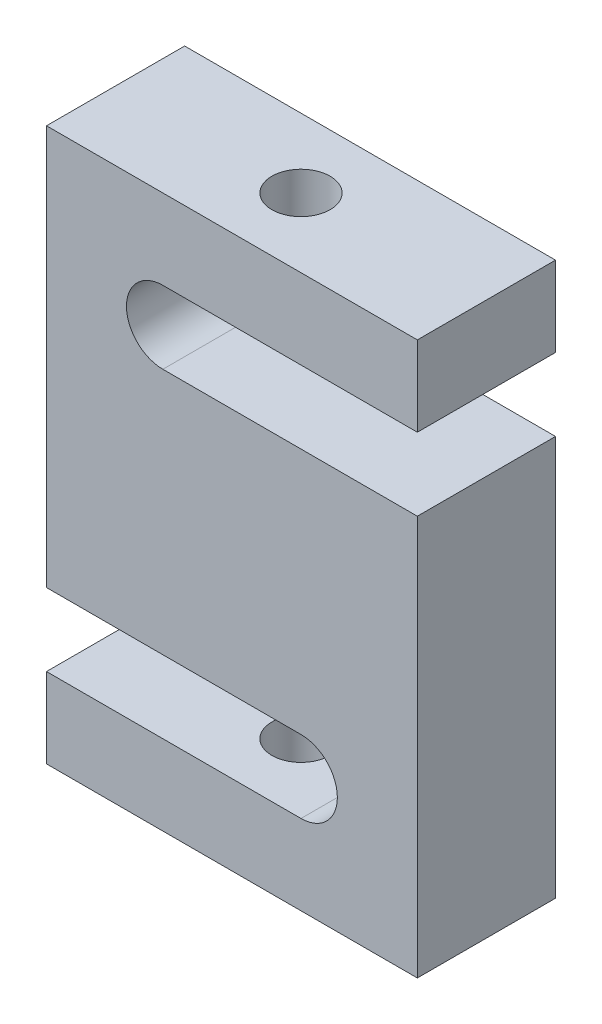
ISO-10303-21;
HEADER;
FILE_DESCRIPTION(('STEP AP214'),'2;1');
FILE_NAME('part.step','',(''),(''),'','','');
FILE_SCHEMA(('AUTOMOTIVE_DESIGN { 1 0 10303 214 1 1 1 1 }'));
ENDSEC;
DATA;
#1=APPLICATION_CONTEXT('core data for automotive mechanical design processes');
#2=APPLICATION_PROTOCOL_DEFINITION('international standard','automotive_design',2000,#1);
#3=PRODUCT_CONTEXT('',#1,'mechanical');
#4=PRODUCT('Part','Part','',(#3));
#5=PRODUCT_RELATED_PRODUCT_CATEGORY('part','',(#4));
#6=PRODUCT_DEFINITION_FORMATION('','',#4);
#7=PRODUCT_DEFINITION_CONTEXT('part definition',#1,'design');
#8=PRODUCT_DEFINITION('design','',#6,#7);
#9=PRODUCT_DEFINITION_SHAPE('','',#8);
#10=(LENGTH_UNIT() NAMED_UNIT(*) SI_UNIT(.MILLI.,.METRE.));
#11=(NAMED_UNIT(*) PLANE_ANGLE_UNIT() SI_UNIT($,.RADIAN.));
#12=(NAMED_UNIT(*) SI_UNIT($,.STERADIAN.) SOLID_ANGLE_UNIT());
#13=UNCERTAINTY_MEASURE_WITH_UNIT(LENGTH_MEASURE(1.E-05),#10,'distance_accuracy_value','');
#14=(GEOMETRIC_REPRESENTATION_CONTEXT(3) GLOBAL_UNCERTAINTY_ASSIGNED_CONTEXT((#13)) GLOBAL_UNIT_ASSIGNED_CONTEXT((#10,
#11,#12)) REPRESENTATION_CONTEXT('',''));
#15=CARTESIAN_POINT('',(0.,0.,0.));
#16=DIRECTION('',(0.,0.,1.));
#17=DIRECTION('',(1.,0.,0.));
#18=AXIS2_PLACEMENT_3D('',#15,#16,#17);
#19=CARTESIAN_POINT('',(25.5,-38.,19.));
#20=DIRECTION('',(-1.,0.,0.));
#21=DIRECTION('',(0.,0.,1.));
#22=AXIS2_PLACEMENT_3D('',#19,#20,#21);
#23=PLANE('',#22);
#24=DIRECTION('',(0.,1.,0.));
#25=VECTOR('',#24,1.);
#26=CARTESIAN_POINT('',(25.5,-38.,19.));
#27=LINE('',#26,#25);
#28=CARTESIAN_POINT('',(25.5,27.,19.));
#29=VERTEX_POINT('',#28);
#30=CARTESIAN_POINT('',(25.5,38.,19.));
#31=VERTEX_POINT('',#30);
#32=EDGE_CURVE('E155',#29,#31,#27,.T.);
#33=ORIENTED_EDGE('',*,*,#32,.F.);
#34=DIRECTION('',(0.,0.,-1.));
#35=VECTOR('',#34,1.);
#36=CARTESIAN_POINT('',(25.5,27.,19.));
#37=LINE('',#36,#35);
#38=CARTESIAN_POINT('',(25.5,27.,0.));
#39=VERTEX_POINT('',#38);
#40=EDGE_CURVE('E208',#29,#39,#37,.T.);
#41=ORIENTED_EDGE('',*,*,#40,.T.);
#42=DIRECTION('',(0.,1.,0.));
#43=VECTOR('',#42,1.);
#44=CARTESIAN_POINT('',(25.5,-38.,0.));
#45=LINE('',#44,#43);
#46=CARTESIAN_POINT('',(25.5,38.,0.));
#47=VERTEX_POINT('',#46);
#48=EDGE_CURVE('E171',#39,#47,#45,.T.);
#49=ORIENTED_EDGE('',*,*,#48,.T.);
#50=DIRECTION('',(0.,0.,-1.));
#51=VECTOR('',#50,1.);
#52=CARTESIAN_POINT('',(25.5,38.,19.));
#53=LINE('',#52,#51);
#54=EDGE_CURVE('E11',#31,#47,#53,.T.);
#55=ORIENTED_EDGE('',*,*,#54,.F.);
#56=EDGE_LOOP('',(#33,#41,#49,#55));
#57=FACE_BOUND('',#56,.T.);
#58=ADVANCED_FACE('F41',(#57),#23,.F.);
#59=CARTESIAN_POINT('',(-25.5,-38.,19.));
#60=DIRECTION('',(1.,0.,0.));
#61=DIRECTION('',(0.,0.,-1.));
#62=AXIS2_PLACEMENT_3D('',#59,#60,#61);
#63=PLANE('',#62);
#64=DIRECTION('',(0.,-1.,0.));
#65=VECTOR('',#64,1.);
#66=CARTESIAN_POINT('',(-25.5,-38.,0.));
#67=LINE('',#66,#65);
#68=CARTESIAN_POINT('',(-25.5,38.,0.));
#69=VERTEX_POINT('',#68);
#70=CARTESIAN_POINT('',(-25.5,-17.,0.));
#71=VERTEX_POINT('',#70);
#72=EDGE_CURVE('E174',#69,#71,#67,.T.);
#73=ORIENTED_EDGE('',*,*,#72,.T.);
#74=DIRECTION('',(0.,0.,-1.));
#75=VECTOR('',#74,1.);
#76=CARTESIAN_POINT('',(-25.5,-17.,19.));
#77=LINE('',#76,#75);
#78=CARTESIAN_POINT('',(-25.5,-17.,19.));
#79=VERTEX_POINT('',#78);
#80=EDGE_CURVE('E228',#79,#71,#77,.T.);
#81=ORIENTED_EDGE('',*,*,#80,.F.);
#82=DIRECTION('',(0.,-1.,0.));
#83=VECTOR('',#82,1.);
#84=CARTESIAN_POINT('',(-25.5,-38.,19.));
#85=LINE('',#84,#83);
#86=CARTESIAN_POINT('',(-25.5,38.,19.));
#87=VERTEX_POINT('',#86);
#88=EDGE_CURVE('E164',#87,#79,#85,.T.);
#89=ORIENTED_EDGE('',*,*,#88,.F.);
#90=DIRECTION('',(0.,0.,-1.));
#91=VECTOR('',#90,1.);
#92=CARTESIAN_POINT('',(-25.5,38.,19.));
#93=LINE('',#92,#91);
#94=EDGE_CURVE('E50',#87,#69,#93,.T.);
#95=ORIENTED_EDGE('',*,*,#94,.T.);
#96=EDGE_LOOP('',(#73,#81,#89,#95));
#97=FACE_BOUND('',#96,.T.);
#98=ADVANCED_FACE('F265',(#97),#63,.F.);
#99=CARTESIAN_POINT('',(25.5,-38.,0.));
#100=VERTEX_POINT('',#99);
#101=CARTESIAN_POINT('',(25.5,17.,0.));
#102=VERTEX_POINT('',#101);
#103=EDGE_CURVE('E147',#100,#102,#45,.T.);
#104=ORIENTED_EDGE('',*,*,#103,.T.);
#105=DIRECTION('',(0.,0.,-1.));
#106=VECTOR('',#105,1.);
#107=CARTESIAN_POINT('',(25.5,17.,19.));
#108=LINE('',#107,#106);
#109=CARTESIAN_POINT('',(25.5,17.,19.));
#110=VERTEX_POINT('',#109);
#111=EDGE_CURVE('E66',#110,#102,#108,.T.);
#112=ORIENTED_EDGE('',*,*,#111,.F.);
#113=CARTESIAN_POINT('',(25.5,-38.,19.));
#114=VERTEX_POINT('',#113);
#115=EDGE_CURVE('E145',#114,#110,#27,.T.);
#116=ORIENTED_EDGE('',*,*,#115,.F.);
#117=DIRECTION('',(0.,0.,-1.));
#118=VECTOR('',#117,1.);
#119=CARTESIAN_POINT('',(25.5,-38.,19.));
#120=LINE('',#119,#118);
#121=EDGE_CURVE('E168',#114,#100,#120,.T.);
#122=ORIENTED_EDGE('',*,*,#121,.T.);
#123=EDGE_LOOP('',(#104,#112,#116,#122));
#124=FACE_BOUND('',#123,.T.);
#125=ADVANCED_FACE('F43',(#124),#23,.F.);
#126=CARTESIAN_POINT('',(-25.5,38.,19.));
#127=DIRECTION('',(0.,-1.,0.));
#128=DIRECTION('',(0.,0.,-1.));
#129=AXIS2_PLACEMENT_3D('',#126,#127,#128);
#130=PLANE('',#129);
#131=CARTESIAN_POINT('',(0.,38.,9.50000000000136));
#132=DIRECTION('',(0.,1.,0.));
#133=DIRECTION('',(0.,0.,1.));
#134=AXIS2_PLACEMENT_3D('',#131,#132,#133);
#135=CIRCLE('',#134,4.);
#136=CARTESIAN_POINT('',(0.,38.,13.5000000000014));
#137=VERTEX_POINT('',#136);
#138=EDGE_CURVE('E185',#137,#137,#135,.T.);
#139=ORIENTED_EDGE('',*,*,#138,.F.);
#140=EDGE_LOOP('',(#139));
#141=FACE_BOUND('',#140,.T.);
#142=DIRECTION('',(-1.,0.,0.));
#143=VECTOR('',#142,1.);
#144=CARTESIAN_POINT('',(-25.5,38.,0.));
#145=LINE('',#144,#143);
#146=EDGE_CURVE('E170',#47,#69,#145,.T.);
#147=ORIENTED_EDGE('',*,*,#146,.T.);
#148=ORIENTED_EDGE('',*,*,#94,.F.);
#149=DIRECTION('',(-1.,0.,0.));
#150=VECTOR('',#149,1.);
#151=CARTESIAN_POINT('',(-25.5,38.,19.));
#152=LINE('',#151,#150);
#153=EDGE_CURVE('E154',#31,#87,#152,.T.);
#154=ORIENTED_EDGE('',*,*,#153,.F.);
#155=ORIENTED_EDGE('',*,*,#54,.T.);
#156=EDGE_LOOP('',(#147,#148,#154,#155));
#157=FACE_BOUND('',#156,.T.);
#158=ADVANCED_FACE('F260',(#141,#157),#130,.F.);
#159=CARTESIAN_POINT('',(-25.5,-27.,19.));
#160=VERTEX_POINT('',#159);
#161=CARTESIAN_POINT('',(-25.5,-38.,19.));
#162=VERTEX_POINT('',#161);
#163=EDGE_CURVE('E157',#160,#162,#85,.T.);
#164=ORIENTED_EDGE('',*,*,#163,.F.);
#165=DIRECTION('',(0.,0.,-1.));
#166=VECTOR('',#165,1.);
#167=CARTESIAN_POINT('',(-25.5,-27.,19.));
#168=LINE('',#167,#166);
#169=CARTESIAN_POINT('',(-25.5,-27.,0.));
#170=VERTEX_POINT('',#169);
#171=EDGE_CURVE('E229',#160,#170,#168,.T.);
#172=ORIENTED_EDGE('',*,*,#171,.T.);
#173=CARTESIAN_POINT('',(-25.5,-38.,0.));
#174=VERTEX_POINT('',#173);
#175=EDGE_CURVE('E173',#170,#174,#67,.T.);
#176=ORIENTED_EDGE('',*,*,#175,.T.);
#177=DIRECTION('',(0.,0.,-1.));
#178=VECTOR('',#177,1.);
#179=CARTESIAN_POINT('',(-25.5,-38.,19.));
#180=LINE('',#179,#178);
#181=EDGE_CURVE('E179',#162,#174,#180,.T.);
#182=ORIENTED_EDGE('',*,*,#181,.F.);
#183=EDGE_LOOP('',(#164,#172,#176,#182));
#184=FACE_BOUND('',#183,.T.);
#185=ADVANCED_FACE('F245',(#184),#63,.F.);
#186=CARTESIAN_POINT('',(-25.5,-38.,19.));
#187=DIRECTION('',(0.,1.,0.));
#188=DIRECTION('',(0.,0.,1.));
#189=AXIS2_PLACEMENT_3D('',#186,#187,#188);
#190=PLANE('',#189);
#191=CARTESIAN_POINT('',(0.,-38.,9.50000000000136));
#192=DIRECTION('',(0.,1.,0.));
#193=DIRECTION('',(0.,0.,1.));
#194=AXIS2_PLACEMENT_3D('',#191,#192,#193);
#195=CIRCLE('',#194,4.);
#196=CARTESIAN_POINT('',(0.,-38.,13.5000000000014));
#197=VERTEX_POINT('',#196);
#198=EDGE_CURVE('E195',#197,#197,#195,.T.);
#199=ORIENTED_EDGE('',*,*,#198,.T.);
#200=EDGE_LOOP('',(#199));
#201=FACE_BOUND('',#200,.T.);
#202=DIRECTION('',(1.,0.,0.));
#203=VECTOR('',#202,1.);
#204=CARTESIAN_POINT('',(-25.5,-38.,0.));
#205=LINE('',#204,#203);
#206=EDGE_CURVE('E159',#174,#100,#205,.T.);
#207=ORIENTED_EDGE('',*,*,#206,.T.);
#208=ORIENTED_EDGE('',*,*,#121,.F.);
#209=DIRECTION('',(1.,0.,0.));
#210=VECTOR('',#209,1.);
#211=CARTESIAN_POINT('',(-25.5,-38.,19.));
#212=LINE('',#211,#210);
#213=EDGE_CURVE('E152',#162,#114,#212,.T.);
#214=ORIENTED_EDGE('',*,*,#213,.F.);
#215=ORIENTED_EDGE('',*,*,#181,.T.);
#216=EDGE_LOOP('',(#207,#208,#214,#215));
#217=FACE_BOUND('',#216,.T.);
#218=ADVANCED_FACE('F247',(#201,#217),#190,.F.);
#219=CARTESIAN_POINT('',(0.,0.,19.));
#220=DIRECTION('',(0.,0.,-1.));
#221=DIRECTION('',(-1.,0.,0.));
#222=AXIS2_PLACEMENT_3D('',#219,#220,#221);
#223=PLANE('',#222);
#224=CARTESIAN_POINT('',(-9.5,22.,19.));
#225=DIRECTION('',(0.,0.,-1.));
#226=DIRECTION('',(-1.,0.,0.));
#227=AXIS2_PLACEMENT_3D('',#224,#225,#226);
#228=CIRCLE('',#227,5.);
#229=CARTESIAN_POINT('',(-9.5,17.,19.));
#230=VERTEX_POINT('',#229);
#231=CARTESIAN_POINT('',(-9.5,27.,19.));
#232=VERTEX_POINT('',#231);
#233=EDGE_CURVE('E138',#230,#232,#228,.T.);
#234=ORIENTED_EDGE('',*,*,#233,.T.);
#235=DIRECTION('',(1.,0.,0.));
#236=VECTOR('',#235,1.);
#237=CARTESIAN_POINT('',(25.5,27.,19.));
#238=LINE('',#237,#236);
#239=EDGE_CURVE('E148',#232,#29,#238,.T.);
#240=ORIENTED_EDGE('',*,*,#239,.T.);
#241=ORIENTED_EDGE('',*,*,#32,.T.);
#242=ORIENTED_EDGE('',*,*,#153,.T.);
#243=ORIENTED_EDGE('',*,*,#88,.T.);
#244=DIRECTION('',(1.,0.,0.));
#245=VECTOR('',#244,1.);
#246=CARTESIAN_POINT('',(9.50000000000001,-17.,19.));
#247=LINE('',#246,#245);
#248=CARTESIAN_POINT('',(9.50000000000001,-17.,19.));
#249=VERTEX_POINT('',#248);
#250=EDGE_CURVE('E221',#79,#249,#247,.T.);
#251=ORIENTED_EDGE('',*,*,#250,.T.);
#252=CARTESIAN_POINT('',(9.50000000000001,-22.,19.));
#253=DIRECTION('',(0.,0.,-1.));
#254=DIRECTION('',(-1.,0.,0.));
#255=AXIS2_PLACEMENT_3D('',#252,#253,#254);
#256=CIRCLE('',#255,5.00000000000001);
#257=CARTESIAN_POINT('',(9.50000000000001,-27.,19.));
#258=VERTEX_POINT('',#257);
#259=EDGE_CURVE('E214',#249,#258,#256,.T.);
#260=ORIENTED_EDGE('',*,*,#259,.T.);
#261=DIRECTION('',(-1.,0.,0.));
#262=VECTOR('',#261,1.);
#263=CARTESIAN_POINT('',(-25.5,-27.,19.));
#264=LINE('',#263,#262);
#265=EDGE_CURVE('E217',#258,#160,#264,.T.);
#266=ORIENTED_EDGE('',*,*,#265,.T.);
#267=ORIENTED_EDGE('',*,*,#163,.T.);
#268=ORIENTED_EDGE('',*,*,#213,.T.);
#269=ORIENTED_EDGE('',*,*,#115,.T.);
#270=DIRECTION('',(-1.,0.,0.));
#271=VECTOR('',#270,1.);
#272=CARTESIAN_POINT('',(-9.5,17.,19.));
#273=LINE('',#272,#271);
#274=EDGE_CURVE('E131',#110,#230,#273,.T.);
#275=ORIENTED_EDGE('',*,*,#274,.T.);
#276=EDGE_LOOP('',(#234,#240,#241,#242,#243,#251,#260,#266,#267,#268,#269,#275));
#277=FACE_BOUND('',#276,.T.);
#278=ADVANCED_FACE('F150',(#277),#223,.F.);
#279=CARTESIAN_POINT('',(0.,0.,0.));
#280=DIRECTION('',(0.,0.,-1.));
#281=DIRECTION('',(-1.,0.,0.));
#282=AXIS2_PLACEMENT_3D('',#279,#280,#281);
#283=PLANE('',#282);
#284=DIRECTION('',(1.,0.,0.));
#285=VECTOR('',#284,1.);
#286=CARTESIAN_POINT('',(25.5,27.,0.));
#287=LINE('',#286,#285);
#288=CARTESIAN_POINT('',(-9.5,27.,0.));
#289=VERTEX_POINT('',#288);
#290=EDGE_CURVE('E139',#289,#39,#287,.T.);
#291=ORIENTED_EDGE('',*,*,#290,.F.);
#292=CARTESIAN_POINT('',(-9.5,22.,0.));
#293=DIRECTION('',(0.,0.,-1.));
#294=DIRECTION('',(-1.,0.,0.));
#295=AXIS2_PLACEMENT_3D('',#292,#293,#294);
#296=CIRCLE('',#295,5.);
#297=CARTESIAN_POINT('',(-9.5,17.,0.));
#298=VERTEX_POINT('',#297);
#299=EDGE_CURVE('E203',#298,#289,#296,.T.);
#300=ORIENTED_EDGE('',*,*,#299,.F.);
#301=DIRECTION('',(-1.,0.,0.));
#302=VECTOR('',#301,1.);
#303=CARTESIAN_POINT('',(-9.5,17.,0.));
#304=LINE('',#303,#302);
#305=EDGE_CURVE('E201',#102,#298,#304,.T.);
#306=ORIENTED_EDGE('',*,*,#305,.F.);
#307=ORIENTED_EDGE('',*,*,#103,.F.);
#308=ORIENTED_EDGE('',*,*,#206,.F.);
#309=ORIENTED_EDGE('',*,*,#175,.F.);
#310=DIRECTION('',(-1.,0.,0.));
#311=VECTOR('',#310,1.);
#312=CARTESIAN_POINT('',(-25.5,-27.,0.));
#313=LINE('',#312,#311);
#314=CARTESIAN_POINT('',(9.50000000000001,-27.,0.));
#315=VERTEX_POINT('',#314);
#316=EDGE_CURVE('E188',#315,#170,#313,.T.);
#317=ORIENTED_EDGE('',*,*,#316,.F.);
#318=CARTESIAN_POINT('',(9.50000000000001,-22.,0.));
#319=DIRECTION('',(0.,0.,-1.));
#320=DIRECTION('',(-1.,0.,0.));
#321=AXIS2_PLACEMENT_3D('',#318,#319,#320);
#322=CIRCLE('',#321,5.00000000000001);
#323=CARTESIAN_POINT('',(9.50000000000001,-17.,0.));
#324=VERTEX_POINT('',#323);
#325=EDGE_CURVE('E58',#324,#315,#322,.T.);
#326=ORIENTED_EDGE('',*,*,#325,.F.);
#327=DIRECTION('',(1.,0.,0.));
#328=VECTOR('',#327,1.);
#329=CARTESIAN_POINT('',(9.50000000000001,-17.,0.));
#330=LINE('',#329,#328);
#331=EDGE_CURVE('E218',#71,#324,#330,.T.);
#332=ORIENTED_EDGE('',*,*,#331,.F.);
#333=ORIENTED_EDGE('',*,*,#72,.F.);
#334=ORIENTED_EDGE('',*,*,#146,.F.);
#335=ORIENTED_EDGE('',*,*,#48,.F.);
#336=EDGE_LOOP('',(#291,#300,#306,#307,#308,#309,#317,#326,#332,#333,#334,#335));
#337=FACE_BOUND('',#336,.T.);
#338=ADVANCED_FACE('F241',(#337),#283,.T.);
#339=CARTESIAN_POINT('',(9.50000000000001,-22.,19.));
#340=DIRECTION('',(0.,0.,-1.));
#341=DIRECTION('',(-1.,0.,0.));
#342=AXIS2_PLACEMENT_3D('',#339,#340,#341);
#343=CYLINDRICAL_SURFACE('',#342,5.00000000000001);
#344=ORIENTED_EDGE('',*,*,#325,.T.);
#345=DIRECTION('',(0.,0.,-1.));
#346=VECTOR('',#345,1.);
#347=CARTESIAN_POINT('',(9.50000000000001,-27.,19.));
#348=LINE('',#347,#346);
#349=EDGE_CURVE('E161',#258,#315,#348,.T.);
#350=ORIENTED_EDGE('',*,*,#349,.F.);
#351=ORIENTED_EDGE('',*,*,#259,.F.);
#352=DIRECTION('',(0.,0.,-1.));
#353=VECTOR('',#352,1.);
#354=CARTESIAN_POINT('',(9.50000000000001,-17.,19.));
#355=LINE('',#354,#353);
#356=EDGE_CURVE('E204',#249,#324,#355,.T.);
#357=ORIENTED_EDGE('',*,*,#356,.T.);
#358=EDGE_LOOP('',(#344,#350,#351,#357));
#359=FACE_BOUND('',#358,.T.);
#360=ADVANCED_FACE('F269',(#359),#343,.F.);
#361=CARTESIAN_POINT('',(9.50000000000001,-17.,19.));
#362=DIRECTION('',(0.,1.,0.));
#363=DIRECTION('',(-1.,0.,0.));
#364=AXIS2_PLACEMENT_3D('',#361,#362,#363);
#365=PLANE('',#364);
#366=ORIENTED_EDGE('',*,*,#331,.T.);
#367=ORIENTED_EDGE('',*,*,#356,.F.);
#368=ORIENTED_EDGE('',*,*,#250,.F.);
#369=ORIENTED_EDGE('',*,*,#80,.T.);
#370=EDGE_LOOP('',(#366,#367,#368,#369));
#371=FACE_BOUND('',#370,.T.);
#372=ADVANCED_FACE('F268',(#371),#365,.F.);
#373=CARTESIAN_POINT('',(-25.5,-27.,19.));
#374=DIRECTION('',(0.,-1.,0.));
#375=DIRECTION('',(1.,0.,0.));
#376=AXIS2_PLACEMENT_3D('',#373,#374,#375);
#377=PLANE('',#376);
#378=CARTESIAN_POINT('',(0.,-27.,9.50000000000136));
#379=DIRECTION('',(0.,-1.,0.));
#380=DIRECTION('',(1.,0.,0.));
#381=AXIS2_PLACEMENT_3D('',#378,#379,#380);
#382=CIRCLE('',#381,4.);
#383=CARTESIAN_POINT('',(4.,-27.,9.50000000000136));
#384=VERTEX_POINT('',#383);
#385=EDGE_CURVE('E45',#384,#384,#382,.F.);
#386=ORIENTED_EDGE('',*,*,#385,.F.);
#387=EDGE_LOOP('',(#386));
#388=FACE_BOUND('',#387,.T.);
#389=ORIENTED_EDGE('',*,*,#316,.T.);
#390=ORIENTED_EDGE('',*,*,#171,.F.);
#391=ORIENTED_EDGE('',*,*,#265,.F.);
#392=ORIENTED_EDGE('',*,*,#349,.T.);
#393=EDGE_LOOP('',(#389,#390,#391,#392));
#394=FACE_BOUND('',#393,.T.);
#395=ADVANCED_FACE('F237',(#388,#394),#377,.F.);
#396=CARTESIAN_POINT('',(25.5,27.,19.));
#397=DIRECTION('',(0.,1.,0.));
#398=DIRECTION('',(0.,0.,1.));
#399=AXIS2_PLACEMENT_3D('',#396,#397,#398);
#400=PLANE('',#399);
#401=CARTESIAN_POINT('',(0.,27.,9.50000000000136));
#402=DIRECTION('',(0.,1.,0.));
#403=DIRECTION('',(0.,0.,1.));
#404=AXIS2_PLACEMENT_3D('',#401,#402,#403);
#405=CIRCLE('',#404,4.);
#406=CARTESIAN_POINT('',(0.,27.,13.5000000000014));
#407=VERTEX_POINT('',#406);
#408=EDGE_CURVE('E183',#407,#407,#405,.T.);
#409=ORIENTED_EDGE('',*,*,#408,.T.);
#410=EDGE_LOOP('',(#409));
#411=FACE_BOUND('',#410,.T.);
#412=ORIENTED_EDGE('',*,*,#290,.T.);
#413=ORIENTED_EDGE('',*,*,#40,.F.);
#414=ORIENTED_EDGE('',*,*,#239,.F.);
#415=DIRECTION('',(0.,0.,-1.));
#416=VECTOR('',#415,1.);
#417=CARTESIAN_POINT('',(-9.5,27.,19.));
#418=LINE('',#417,#416);
#419=EDGE_CURVE('E211',#232,#289,#418,.T.);
#420=ORIENTED_EDGE('',*,*,#419,.T.);
#421=EDGE_LOOP('',(#412,#413,#414,#420));
#422=FACE_BOUND('',#421,.T.);
#423=ADVANCED_FACE('F328',(#411,#422),#400,.F.);
#424=CARTESIAN_POINT('',(-9.5,22.,19.));
#425=DIRECTION('',(0.,0.,-1.));
#426=DIRECTION('',(-1.,0.,0.));
#427=AXIS2_PLACEMENT_3D('',#424,#425,#426);
#428=CYLINDRICAL_SURFACE('',#427,5.);
#429=ORIENTED_EDGE('',*,*,#299,.T.);
#430=ORIENTED_EDGE('',*,*,#419,.F.);
#431=ORIENTED_EDGE('',*,*,#233,.F.);
#432=DIRECTION('',(0.,0.,-1.));
#433=VECTOR('',#432,1.);
#434=CARTESIAN_POINT('',(-9.5,17.,19.));
#435=LINE('',#434,#433);
#436=EDGE_CURVE('E133',#230,#298,#435,.T.);
#437=ORIENTED_EDGE('',*,*,#436,.T.);
#438=EDGE_LOOP('',(#429,#430,#431,#437));
#439=FACE_BOUND('',#438,.T.);
#440=ADVANCED_FACE('F251',(#439),#428,.F.);
#441=CARTESIAN_POINT('',(-9.5,17.,19.));
#442=DIRECTION('',(0.,-1.,0.));
#443=DIRECTION('',(1.,0.,0.));
#444=AXIS2_PLACEMENT_3D('',#441,#442,#443);
#445=PLANE('',#444);
#446=ORIENTED_EDGE('',*,*,#305,.T.);
#447=ORIENTED_EDGE('',*,*,#436,.F.);
#448=ORIENTED_EDGE('',*,*,#274,.F.);
#449=ORIENTED_EDGE('',*,*,#111,.T.);
#450=EDGE_LOOP('',(#446,#447,#448,#449));
#451=FACE_BOUND('',#450,.T.);
#452=ADVANCED_FACE('F132',(#451),#445,.F.);
#453=CARTESIAN_POINT('',(0.,19.,9.50000000000136));
#454=DIRECTION('',(0.,1.,0.));
#455=DIRECTION('',(0.,0.,1.));
#456=AXIS2_PLACEMENT_3D('',#453,#454,#455);
#457=CYLINDRICAL_SURFACE('',#456,4.);
#458=ORIENTED_EDGE('',*,*,#138,.T.);
#459=EDGE_LOOP('',(#458));
#460=FACE_BOUND('',#459,.T.);
#461=ORIENTED_EDGE('',*,*,#408,.F.);
#462=EDGE_LOOP('',(#461));
#463=FACE_BOUND('',#462,.T.);
#464=ADVANCED_FACE('F346',(#460,#463),#457,.F.);
#465=CARTESIAN_POINT('',(0.,-19.,9.50000000000136));
#466=DIRECTION('',(0.,-1.,0.));
#467=DIRECTION('',(0.,0.,-1.));
#468=AXIS2_PLACEMENT_3D('',#465,#466,#467);
#469=CYLINDRICAL_SURFACE('',#468,4.);
#470=ORIENTED_EDGE('',*,*,#198,.F.);
#471=EDGE_LOOP('',(#470));
#472=FACE_BOUND('',#471,.T.);
#473=ORIENTED_EDGE('',*,*,#385,.T.);
#474=EDGE_LOOP('',(#473));
#475=FACE_BOUND('',#474,.T.);
#476=ADVANCED_FACE('F352',(#472,#475),#469,.F.);
#477=CLOSED_SHELL('',(#58,#98,#125,#158,#185,#218,#278,#338,#360,#372,#395,#423,#440,#452,#464,#476));
#478=MANIFOLD_SOLID_BREP('B2',#477);
#479=ADVANCED_BREP_SHAPE_REPRESENTATION('',(#18,#478),#14);
#480=SHAPE_DEFINITION_REPRESENTATION(#9,#479);
ENDSEC;
END-ISO-10303-21;
